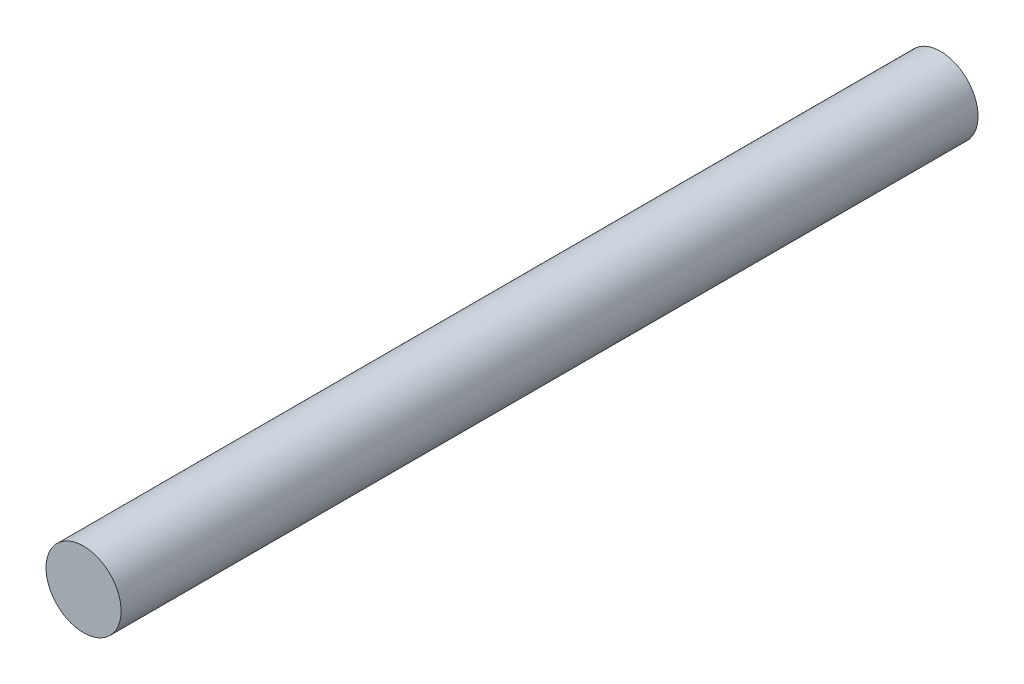
ISO-10303-21;
HEADER;
FILE_DESCRIPTION(('STEP AP214'),'2;1');
FILE_NAME('part.step','',(''),(''),'','','');
FILE_SCHEMA(('AUTOMOTIVE_DESIGN { 1 0 10303 214 1 1 1 1 }'));
ENDSEC;
DATA;
#1=APPLICATION_CONTEXT('core data for automotive mechanical design processes');
#2=APPLICATION_PROTOCOL_DEFINITION('international standard','automotive_design',2000,#1);
#3=PRODUCT_CONTEXT('',#1,'mechanical');
#4=PRODUCT('Part','Part','',(#3));
#5=PRODUCT_RELATED_PRODUCT_CATEGORY('part','',(#4));
#6=PRODUCT_DEFINITION_FORMATION('','',#4);
#7=PRODUCT_DEFINITION_CONTEXT('part definition',#1,'design');
#8=PRODUCT_DEFINITION('design','',#6,#7);
#9=PRODUCT_DEFINITION_SHAPE('','',#8);
#10=(LENGTH_UNIT() NAMED_UNIT(*) SI_UNIT(.MILLI.,.METRE.));
#11=(NAMED_UNIT(*) PLANE_ANGLE_UNIT() SI_UNIT($,.RADIAN.));
#12=(NAMED_UNIT(*) SI_UNIT($,.STERADIAN.) SOLID_ANGLE_UNIT());
#13=UNCERTAINTY_MEASURE_WITH_UNIT(LENGTH_MEASURE(1.E-05),#10,'distance_accuracy_value','');
#14=(GEOMETRIC_REPRESENTATION_CONTEXT(3) GLOBAL_UNCERTAINTY_ASSIGNED_CONTEXT((#13)) GLOBAL_UNIT_ASSIGNED_CONTEXT((#10,
#11,#12)) REPRESENTATION_CONTEXT('',''));
#15=CARTESIAN_POINT('',(0.,0.,0.));
#16=DIRECTION('',(0.,0.,1.));
#17=DIRECTION('',(1.,0.,0.));
#18=AXIS2_PLACEMENT_3D('',#15,#16,#17);
#19=CARTESIAN_POINT('',(18.7566950653859,458.64694123813,-1936.68964761882));
#20=DIRECTION('',(0.,0.,1.));
#21=DIRECTION('',(1.,0.,0.));
#22=AXIS2_PLACEMENT_3D('',#19,#20,#21);
#23=CYLINDRICAL_SURFACE('',#22,7.44999999999999);
#24=CARTESIAN_POINT('',(18.7566950653859,458.64694123813,-1936.68964761882));
#25=DIRECTION('',(0.,0.,-1.));
#26=DIRECTION('',(-1.,0.,0.));
#27=AXIS2_PLACEMENT_3D('',#24,#25,#26);
#28=CIRCLE('',#27,7.44999999999999);
#29=CARTESIAN_POINT('',(11.3066950653859,458.64694123813,-1936.68964761882));
#30=VERTEX_POINT('',#29);
#31=EDGE_CURVE('E10',#30,#30,#28,.T.);
#32=ORIENTED_EDGE('',*,*,#31,.F.);
#33=EDGE_LOOP('',(#32));
#34=FACE_BOUND('',#33,.T.);
#35=CARTESIAN_POINT('',(18.7566950653859,458.64694123813,-1766.68964761882));
#36=DIRECTION('',(0.,0.,-1.));
#37=DIRECTION('',(-1.,0.,0.));
#38=AXIS2_PLACEMENT_3D('',#35,#36,#37);
#39=CIRCLE('',#38,7.44999999999999);
#40=CARTESIAN_POINT('',(11.3066950653859,458.64694123813,-1766.68964761882));
#41=VERTEX_POINT('',#40);
#42=EDGE_CURVE('E42',#41,#41,#39,.T.);
#43=ORIENTED_EDGE('',*,*,#42,.T.);
#44=EDGE_LOOP('',(#43));
#45=FACE_BOUND('',#44,.T.);
#46=ADVANCED_FACE('F39',(#34,#45),#23,.T.);
#47=CARTESIAN_POINT('',(18.7566950653859,458.64694123813,-1936.68964761882));
#48=DIRECTION('',(0.,0.,-1.));
#49=DIRECTION('',(-1.,0.,0.));
#50=AXIS2_PLACEMENT_3D('',#47,#48,#49);
#51=PLANE('',#50);
#52=ORIENTED_EDGE('',*,*,#31,.T.);
#53=EDGE_LOOP('',(#52));
#54=FACE_BOUND('',#53,.T.);
#55=ADVANCED_FACE('F54',(#54),#51,.T.);
#56=CARTESIAN_POINT('',(18.7566950653859,458.64694123813,-1766.68964761882));
#57=DIRECTION('',(0.,0.,-1.));
#58=DIRECTION('',(-1.,0.,0.));
#59=AXIS2_PLACEMENT_3D('',#56,#57,#58);
#60=PLANE('',#59);
#61=ORIENTED_EDGE('',*,*,#42,.F.);
#62=EDGE_LOOP('',(#61));
#63=FACE_BOUND('',#62,.T.);
#64=ADVANCED_FACE('F52',(#63),#60,.F.);
#65=CLOSED_SHELL('',(#46,#55,#64));
#66=MANIFOLD_SOLID_BREP('B2',#65);
#67=ADVANCED_BREP_SHAPE_REPRESENTATION('',(#18,#66),#14);
#68=SHAPE_DEFINITION_REPRESENTATION(#9,#67);
ENDSEC;
END-ISO-10303-21;
